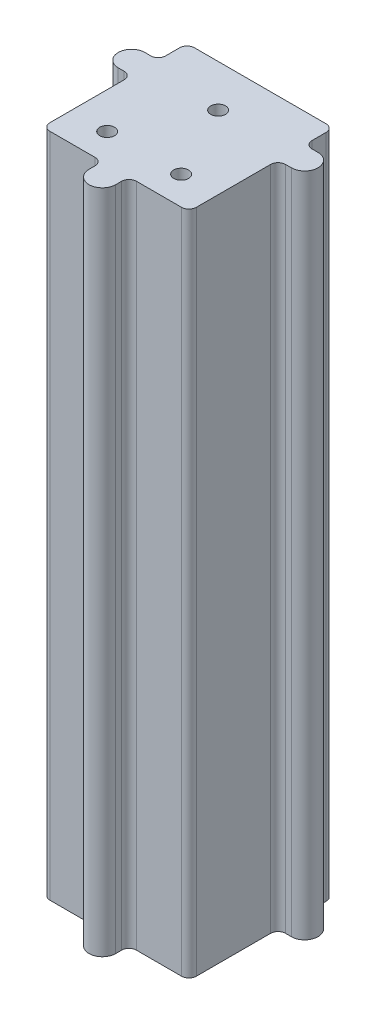
ISO-10303-21;
HEADER;
FILE_DESCRIPTION(('STEP AP214'),'2;1');
FILE_NAME('part.step','',(''),(''),'','','');
FILE_SCHEMA(('AUTOMOTIVE_DESIGN { 1 0 10303 214 1 1 1 1 }'));
ENDSEC;
DATA;
#1=APPLICATION_CONTEXT('core data for automotive mechanical design processes');
#2=APPLICATION_PROTOCOL_DEFINITION('international standard','automotive_design',2000,#1);
#3=PRODUCT_CONTEXT('',#1,'mechanical');
#4=PRODUCT('Part','Part','',(#3));
#5=PRODUCT_RELATED_PRODUCT_CATEGORY('part','',(#4));
#6=PRODUCT_DEFINITION_FORMATION('','',#4);
#7=PRODUCT_DEFINITION_CONTEXT('part definition',#1,'design');
#8=PRODUCT_DEFINITION('design','',#6,#7);
#9=PRODUCT_DEFINITION_SHAPE('','',#8);
#10=(LENGTH_UNIT() NAMED_UNIT(*) SI_UNIT(.MILLI.,.METRE.));
#11=(NAMED_UNIT(*) PLANE_ANGLE_UNIT() SI_UNIT($,.RADIAN.));
#12=(NAMED_UNIT(*) SI_UNIT($,.STERADIAN.) SOLID_ANGLE_UNIT());
#13=UNCERTAINTY_MEASURE_WITH_UNIT(LENGTH_MEASURE(1.E-05),#10,'distance_accuracy_value','');
#14=(GEOMETRIC_REPRESENTATION_CONTEXT(3) GLOBAL_UNCERTAINTY_ASSIGNED_CONTEXT((#13)) GLOBAL_UNIT_ASSIGNED_CONTEXT((#10,
#11,#12)) REPRESENTATION_CONTEXT('',''));
#15=CARTESIAN_POINT('',(0.,0.,0.));
#16=DIRECTION('',(0.,0.,1.));
#17=DIRECTION('',(1.,0.,0.));
#18=AXIS2_PLACEMENT_3D('',#15,#16,#17);
#19=CARTESIAN_POINT('',(-17.8,180.,-22.145));
#20=DIRECTION('',(0.,-1.,0.));
#21=DIRECTION('',(0.,0.,-1.));
#22=AXIS2_PLACEMENT_3D('',#19,#20,#21);
#23=CYLINDRICAL_SURFACE('',#22,2.);
#24=CARTESIAN_POINT('',(-17.8,0.,-22.145));
#25=DIRECTION('',(0.,-1.,0.));
#26=DIRECTION('',(0.,0.,1.));
#27=AXIS2_PLACEMENT_3D('',#24,#25,#26);
#28=CIRCLE('',#27,2.);
#29=CARTESIAN_POINT('',(-19.8,0.,-22.145));
#30=VERTEX_POINT('',#29);
#31=CARTESIAN_POINT('',(-17.8,0.,-24.145));
#32=VERTEX_POINT('',#31);
#33=EDGE_CURVE('E253',#30,#32,#28,.T.);
#34=ORIENTED_EDGE('',*,*,#33,.F.);
#35=DIRECTION('',(0.,-1.,0.));
#36=VECTOR('',#35,1.);
#37=CARTESIAN_POINT('',(-19.8,180.,-22.145));
#38=LINE('',#37,#36);
#39=CARTESIAN_POINT('',(-19.8,180.,-22.145));
#40=VERTEX_POINT('',#39);
#41=EDGE_CURVE('E11',#40,#30,#38,.T.);
#42=ORIENTED_EDGE('',*,*,#41,.F.);
#43=CARTESIAN_POINT('',(-17.8,180.,-22.145));
#44=DIRECTION('',(0.,-1.,0.));
#45=DIRECTION('',(0.,0.,1.));
#46=AXIS2_PLACEMENT_3D('',#43,#44,#45);
#47=CIRCLE('',#46,2.);
#48=CARTESIAN_POINT('',(-17.8,180.,-24.145));
#49=VERTEX_POINT('',#48);
#50=EDGE_CURVE('E354',#40,#49,#47,.T.);
#51=ORIENTED_EDGE('',*,*,#50,.T.);
#52=DIRECTION('',(0.,-1.,0.));
#53=VECTOR('',#52,1.);
#54=CARTESIAN_POINT('',(-17.8,180.,-24.145));
#55=LINE('',#54,#53);
#56=EDGE_CURVE('E46',#49,#32,#55,.T.);
#57=ORIENTED_EDGE('',*,*,#56,.T.);
#58=EDGE_LOOP('',(#34,#42,#51,#57));
#59=FACE_BOUND('',#58,.T.);
#60=ADVANCED_FACE('F43',(#59),#23,.T.);
#61=CARTESIAN_POINT('',(-19.8,180.,-18.345));
#62=DIRECTION('',(-1.,0.,0.));
#63=DIRECTION('',(0.,0.,1.));
#64=AXIS2_PLACEMENT_3D('',#61,#62,#63);
#65=PLANE('',#64);
#66=DIRECTION('',(0.,0.,-1.));
#67=VECTOR('',#66,1.);
#68=CARTESIAN_POINT('',(-19.8,0.,-18.345));
#69=LINE('',#68,#67);
#70=CARTESIAN_POINT('',(-19.8,0.,-18.345));
#71=VERTEX_POINT('',#70);
#72=EDGE_CURVE('E351',#71,#30,#69,.T.);
#73=ORIENTED_EDGE('',*,*,#72,.F.);
#74=DIRECTION('',(0.,-1.,0.));
#75=VECTOR('',#74,1.);
#76=CARTESIAN_POINT('',(-19.8,180.,-18.345));
#77=LINE('',#76,#75);
#78=CARTESIAN_POINT('',(-19.8,180.,-18.345));
#79=VERTEX_POINT('',#78);
#80=EDGE_CURVE('E53',#79,#71,#77,.T.);
#81=ORIENTED_EDGE('',*,*,#80,.F.);
#82=DIRECTION('',(0.,0.,-1.));
#83=VECTOR('',#82,1.);
#84=CARTESIAN_POINT('',(-19.8,180.,-18.345));
#85=LINE('',#84,#83);
#86=EDGE_CURVE('E239',#79,#40,#85,.T.);
#87=ORIENTED_EDGE('',*,*,#86,.T.);
#88=ORIENTED_EDGE('',*,*,#41,.T.);
#89=EDGE_LOOP('',(#73,#81,#87,#88));
#90=FACE_BOUND('',#89,.T.);
#91=ADVANCED_FACE('F426',(#90),#65,.T.);
#92=CARTESIAN_POINT('',(-21.8,180.,-18.345));
#93=DIRECTION('',(0.,-1.,0.));
#94=DIRECTION('',(0.,0.,-1.));
#95=AXIS2_PLACEMENT_3D('',#92,#93,#94);
#96=CYLINDRICAL_SURFACE('',#95,2.);
#97=CARTESIAN_POINT('',(-21.8,0.,-18.345));
#98=DIRECTION('',(0.,1.,0.));
#99=DIRECTION('',(0.,0.,1.));
#100=AXIS2_PLACEMENT_3D('',#97,#98,#99);
#101=CIRCLE('',#100,2.);
#102=CARTESIAN_POINT('',(-21.8,0.,-16.345));
#103=VERTEX_POINT('',#102);
#104=EDGE_CURVE('E225',#103,#71,#101,.T.);
#105=ORIENTED_EDGE('',*,*,#104,.F.);
#106=DIRECTION('',(0.,-1.,0.));
#107=VECTOR('',#106,1.);
#108=CARTESIAN_POINT('',(-21.8,180.,-16.345));
#109=LINE('',#108,#107);
#110=CARTESIAN_POINT('',(-21.8,180.,-16.345));
#111=VERTEX_POINT('',#110);
#112=EDGE_CURVE('E220',#111,#103,#109,.T.);
#113=ORIENTED_EDGE('',*,*,#112,.F.);
#114=CARTESIAN_POINT('',(-21.8,180.,-18.345));
#115=DIRECTION('',(0.,1.,0.));
#116=DIRECTION('',(0.,0.,1.));
#117=AXIS2_PLACEMENT_3D('',#114,#115,#116);
#118=CIRCLE('',#117,2.);
#119=EDGE_CURVE('E223',#111,#79,#118,.T.);
#120=ORIENTED_EDGE('',*,*,#119,.T.);
#121=ORIENTED_EDGE('',*,*,#80,.T.);
#122=EDGE_LOOP('',(#105,#113,#120,#121));
#123=FACE_BOUND('',#122,.T.);
#124=ADVANCED_FACE('F222',(#123),#96,.F.);
#125=CARTESIAN_POINT('',(-23.4,180.,-16.345));
#126=DIRECTION('',(0.,0.,-1.));
#127=DIRECTION('',(-1.,0.,0.));
#128=AXIS2_PLACEMENT_3D('',#125,#126,#127);
#129=PLANE('',#128);
#130=DIRECTION('',(1.,0.,0.));
#131=VECTOR('',#130,1.);
#132=CARTESIAN_POINT('',(-23.4,0.,-16.345));
#133=LINE('',#132,#131);
#134=CARTESIAN_POINT('',(-23.4,0.,-16.345));
#135=VERTEX_POINT('',#134);
#136=EDGE_CURVE('E346',#135,#103,#133,.T.);
#137=ORIENTED_EDGE('',*,*,#136,.F.);
#138=DIRECTION('',(0.,-1.,0.));
#139=VECTOR('',#138,1.);
#140=CARTESIAN_POINT('',(-23.4,180.,-16.345));
#141=LINE('',#140,#139);
#142=CARTESIAN_POINT('',(-23.4,180.,-16.345));
#143=VERTEX_POINT('',#142);
#144=EDGE_CURVE('E231',#143,#135,#141,.T.);
#145=ORIENTED_EDGE('',*,*,#144,.F.);
#146=DIRECTION('',(1.,0.,0.));
#147=VECTOR('',#146,1.);
#148=CARTESIAN_POINT('',(-23.4,180.,-16.345));
#149=LINE('',#148,#147);
#150=EDGE_CURVE('E237',#143,#111,#149,.T.);
#151=ORIENTED_EDGE('',*,*,#150,.T.);
#152=ORIENTED_EDGE('',*,*,#112,.T.);
#153=EDGE_LOOP('',(#137,#145,#151,#152));
#154=FACE_BOUND('',#153,.T.);
#155=ADVANCED_FACE('F242',(#154),#129,.T.);
#156=CARTESIAN_POINT('',(-23.4,180.,-12.745));
#157=DIRECTION('',(0.,-1.,0.));
#158=DIRECTION('',(0.,0.,-1.));
#159=AXIS2_PLACEMENT_3D('',#156,#157,#158);
#160=CYLINDRICAL_SURFACE('',#159,3.6);
#161=CARTESIAN_POINT('',(-23.4,0.,-12.745));
#162=DIRECTION('',(0.,-1.,0.));
#163=DIRECTION('',(0.,0.,-1.));
#164=AXIS2_PLACEMENT_3D('',#161,#162,#163);
#165=CIRCLE('',#164,3.6);
#166=CARTESIAN_POINT('',(-23.4,0.,-9.145));
#167=VERTEX_POINT('',#166);
#168=EDGE_CURVE('E342',#167,#135,#165,.T.);
#169=ORIENTED_EDGE('',*,*,#168,.F.);
#170=DIRECTION('',(0.,-1.,0.));
#171=VECTOR('',#170,1.);
#172=CARTESIAN_POINT('',(-23.4,180.,-9.145));
#173=LINE('',#172,#171);
#174=CARTESIAN_POINT('',(-23.4,180.,-9.145));
#175=VERTEX_POINT('',#174);
#176=EDGE_CURVE('E360',#175,#167,#173,.T.);
#177=ORIENTED_EDGE('',*,*,#176,.F.);
#178=CARTESIAN_POINT('',(-23.4,180.,-12.745));
#179=DIRECTION('',(0.,-1.,0.));
#180=DIRECTION('',(0.,0.,-1.));
#181=AXIS2_PLACEMENT_3D('',#178,#179,#180);
#182=CIRCLE('',#181,3.6);
#183=EDGE_CURVE('E244',#175,#143,#182,.T.);
#184=ORIENTED_EDGE('',*,*,#183,.T.);
#185=ORIENTED_EDGE('',*,*,#144,.T.);
#186=EDGE_LOOP('',(#169,#177,#184,#185));
#187=FACE_BOUND('',#186,.T.);
#188=ADVANCED_FACE('F439',(#187),#160,.T.);
#189=CARTESIAN_POINT('',(-23.4,180.,-9.145));
#190=DIRECTION('',(0.,0.,1.));
#191=DIRECTION('',(1.,0.,0.));
#192=AXIS2_PLACEMENT_3D('',#189,#190,#191);
#193=PLANE('',#192);
#194=DIRECTION('',(-1.,0.,0.));
#195=VECTOR('',#194,1.);
#196=CARTESIAN_POINT('',(-23.4,0.,-9.145));
#197=LINE('',#196,#195);
#198=CARTESIAN_POINT('',(-21.8,0.,-9.145));
#199=VERTEX_POINT('',#198);
#200=EDGE_CURVE('E338',#199,#167,#197,.T.);
#201=ORIENTED_EDGE('',*,*,#200,.F.);
#202=DIRECTION('',(0.,-1.,0.));
#203=VECTOR('',#202,1.);
#204=CARTESIAN_POINT('',(-21.8,180.,-9.145));
#205=LINE('',#204,#203);
#206=CARTESIAN_POINT('',(-21.8,180.,-9.145));
#207=VERTEX_POINT('',#206);
#208=EDGE_CURVE('E363',#207,#199,#205,.T.);
#209=ORIENTED_EDGE('',*,*,#208,.F.);
#210=DIRECTION('',(-1.,0.,0.));
#211=VECTOR('',#210,1.);
#212=CARTESIAN_POINT('',(-23.4,180.,-9.145));
#213=LINE('',#212,#211);
#214=EDGE_CURVE('E247',#207,#175,#213,.T.);
#215=ORIENTED_EDGE('',*,*,#214,.T.);
#216=ORIENTED_EDGE('',*,*,#176,.T.);
#217=EDGE_LOOP('',(#201,#209,#215,#216));
#218=FACE_BOUND('',#217,.T.);
#219=ADVANCED_FACE('F442',(#218),#193,.T.);
#220=CARTESIAN_POINT('',(-21.8,180.,-7.145));
#221=DIRECTION('',(0.,-1.,0.));
#222=DIRECTION('',(0.,0.,-1.));
#223=AXIS2_PLACEMENT_3D('',#220,#221,#222);
#224=CYLINDRICAL_SURFACE('',#223,2.);
#225=CARTESIAN_POINT('',(-21.8,0.,-7.145));
#226=DIRECTION('',(0.,1.,0.));
#227=DIRECTION('',(0.,0.,-1.));
#228=AXIS2_PLACEMENT_3D('',#225,#226,#227);
#229=CIRCLE('',#228,2.);
#230=CARTESIAN_POINT('',(-19.8,0.,-7.14499999999999));
#231=VERTEX_POINT('',#230);
#232=EDGE_CURVE('E334',#231,#199,#229,.T.);
#233=ORIENTED_EDGE('',*,*,#232,.F.);
#234=DIRECTION('',(0.,-1.,0.));
#235=VECTOR('',#234,1.);
#236=CARTESIAN_POINT('',(-19.8,180.,-7.14499999999999));
#237=LINE('',#236,#235);
#238=CARTESIAN_POINT('',(-19.8,180.,-7.14499999999999));
#239=VERTEX_POINT('',#238);
#240=EDGE_CURVE('E366',#239,#231,#237,.T.);
#241=ORIENTED_EDGE('',*,*,#240,.F.);
#242=CARTESIAN_POINT('',(-21.8,180.,-7.145));
#243=DIRECTION('',(0.,1.,0.));
#244=DIRECTION('',(0.,0.,-1.));
#245=AXIS2_PLACEMENT_3D('',#242,#243,#244);
#246=CIRCLE('',#245,2.);
#247=EDGE_CURVE('E710',#239,#207,#246,.T.);
#248=ORIENTED_EDGE('',*,*,#247,.T.);
#249=ORIENTED_EDGE('',*,*,#208,.T.);
#250=EDGE_LOOP('',(#233,#241,#248,#249));
#251=FACE_BOUND('',#250,.T.);
#252=ADVANCED_FACE('F446',(#251),#224,.F.);
#253=CARTESIAN_POINT('',(-19.8,180.,-7.14499999999999));
#254=DIRECTION('',(-1.,0.,0.));
#255=DIRECTION('',(0.,0.,1.));
#256=AXIS2_PLACEMENT_3D('',#253,#254,#255);
#257=PLANE('',#256);
#258=DIRECTION('',(0.,0.,-1.));
#259=VECTOR('',#258,1.);
#260=CARTESIAN_POINT('',(-19.8,0.,-7.14499999999999));
#261=LINE('',#260,#259);
#262=CARTESIAN_POINT('',(-19.8,0.,12.945));
#263=VERTEX_POINT('',#262);
#264=EDGE_CURVE('E330',#263,#231,#261,.T.);
#265=ORIENTED_EDGE('',*,*,#264,.F.);
#266=DIRECTION('',(0.,-1.,0.));
#267=VECTOR('',#266,1.);
#268=CARTESIAN_POINT('',(-19.8,180.,12.945));
#269=LINE('',#268,#267);
#270=CARTESIAN_POINT('',(-19.8,180.,12.945));
#271=VERTEX_POINT('',#270);
#272=EDGE_CURVE('E369',#271,#263,#269,.T.);
#273=ORIENTED_EDGE('',*,*,#272,.F.);
#274=DIRECTION('',(0.,0.,-1.));
#275=VECTOR('',#274,1.);
#276=CARTESIAN_POINT('',(-19.8,180.,-7.14499999999999));
#277=LINE('',#276,#275);
#278=EDGE_CURVE('E706',#271,#239,#277,.T.);
#279=ORIENTED_EDGE('',*,*,#278,.T.);
#280=ORIENTED_EDGE('',*,*,#240,.T.);
#281=EDGE_LOOP('',(#265,#273,#279,#280));
#282=FACE_BOUND('',#281,.T.);
#283=ADVANCED_FACE('F450',(#282),#257,.T.);
#284=CARTESIAN_POINT('',(-17.8,180.,12.945));
#285=DIRECTION('',(0.,-1.,0.));
#286=DIRECTION('',(0.,0.,-1.));
#287=AXIS2_PLACEMENT_3D('',#284,#285,#286);
#288=CYLINDRICAL_SURFACE('',#287,2.);
#289=CARTESIAN_POINT('',(-17.8,0.,12.945));
#290=DIRECTION('',(0.,-1.,0.));
#291=DIRECTION('',(0.,0.,1.));
#292=AXIS2_PLACEMENT_3D('',#289,#290,#291);
#293=CIRCLE('',#292,2.);
#294=CARTESIAN_POINT('',(-17.8,0.,14.945));
#295=VERTEX_POINT('',#294);
#296=EDGE_CURVE('E326',#295,#263,#293,.T.);
#297=ORIENTED_EDGE('',*,*,#296,.F.);
#298=DIRECTION('',(0.,-1.,0.));
#299=VECTOR('',#298,1.);
#300=CARTESIAN_POINT('',(-17.8,180.,14.945));
#301=LINE('',#300,#299);
#302=CARTESIAN_POINT('',(-17.8,180.,14.945));
#303=VERTEX_POINT('',#302);
#304=EDGE_CURVE('E372',#303,#295,#301,.T.);
#305=ORIENTED_EDGE('',*,*,#304,.F.);
#306=CARTESIAN_POINT('',(-17.8,180.,12.945));
#307=DIRECTION('',(0.,-1.,0.));
#308=DIRECTION('',(0.,0.,1.));
#309=AXIS2_PLACEMENT_3D('',#306,#307,#308);
#310=CIRCLE('',#309,2.);
#311=EDGE_CURVE('E702',#303,#271,#310,.T.);
#312=ORIENTED_EDGE('',*,*,#311,.T.);
#313=ORIENTED_EDGE('',*,*,#272,.T.);
#314=EDGE_LOOP('',(#297,#305,#312,#313));
#315=FACE_BOUND('',#314,.T.);
#316=ADVANCED_FACE('F454',(#315),#288,.T.);
#317=CARTESIAN_POINT('',(-17.8,180.,14.945));
#318=DIRECTION('',(0.,0.,1.));
#319=DIRECTION('',(1.,0.,0.));
#320=AXIS2_PLACEMENT_3D('',#317,#318,#319);
#321=PLANE('',#320);
#322=DIRECTION('',(-1.,0.,0.));
#323=VECTOR('',#322,1.);
#324=CARTESIAN_POINT('',(-17.8,0.,14.945));
#325=LINE('',#324,#323);
#326=CARTESIAN_POINT('',(-5.60000000000002,0.,14.945));
#327=VERTEX_POINT('',#326);
#328=EDGE_CURVE('E322',#327,#295,#325,.T.);
#329=ORIENTED_EDGE('',*,*,#328,.F.);
#330=DIRECTION('',(0.,-1.,0.));
#331=VECTOR('',#330,1.);
#332=CARTESIAN_POINT('',(-5.60000000000002,180.,14.945));
#333=LINE('',#332,#331);
#334=CARTESIAN_POINT('',(-5.60000000000002,180.,14.945));
#335=VERTEX_POINT('',#334);
#336=EDGE_CURVE('E375',#335,#327,#333,.T.);
#337=ORIENTED_EDGE('',*,*,#336,.F.);
#338=DIRECTION('',(-1.,0.,0.));
#339=VECTOR('',#338,1.);
#340=CARTESIAN_POINT('',(-17.8,180.,14.945));
#341=LINE('',#340,#339);
#342=EDGE_CURVE('E698',#335,#303,#341,.T.);
#343=ORIENTED_EDGE('',*,*,#342,.T.);
#344=ORIENTED_EDGE('',*,*,#304,.T.);
#345=EDGE_LOOP('',(#329,#337,#343,#344));
#346=FACE_BOUND('',#345,.T.);
#347=ADVANCED_FACE('F458',(#346),#321,.T.);
#348=CARTESIAN_POINT('',(-5.60000000000001,180.,16.945));
#349=DIRECTION('',(0.,-1.,0.));
#350=DIRECTION('',(0.,0.,-1.));
#351=AXIS2_PLACEMENT_3D('',#348,#349,#350);
#352=CYLINDRICAL_SURFACE('',#351,2.);
#353=CARTESIAN_POINT('',(-5.60000000000001,0.,16.945));
#354=DIRECTION('',(0.,1.,0.));
#355=DIRECTION('',(0.,0.,-1.));
#356=AXIS2_PLACEMENT_3D('',#353,#354,#355);
#357=CIRCLE('',#356,2.);
#358=CARTESIAN_POINT('',(-3.60000000000001,0.,16.945));
#359=VERTEX_POINT('',#358);
#360=EDGE_CURVE('E318',#359,#327,#357,.T.);
#361=ORIENTED_EDGE('',*,*,#360,.F.);
#362=DIRECTION('',(0.,-1.,0.));
#363=VECTOR('',#362,1.);
#364=CARTESIAN_POINT('',(-3.60000000000001,180.,16.945));
#365=LINE('',#364,#363);
#366=CARTESIAN_POINT('',(-3.60000000000001,180.,16.945));
#367=VERTEX_POINT('',#366);
#368=EDGE_CURVE('E378',#367,#359,#365,.T.);
#369=ORIENTED_EDGE('',*,*,#368,.F.);
#370=CARTESIAN_POINT('',(-5.60000000000001,180.,16.945));
#371=DIRECTION('',(0.,1.,0.));
#372=DIRECTION('',(0.,0.,-1.));
#373=AXIS2_PLACEMENT_3D('',#370,#371,#372);
#374=CIRCLE('',#373,2.);
#375=EDGE_CURVE('E694',#367,#335,#374,.T.);
#376=ORIENTED_EDGE('',*,*,#375,.T.);
#377=ORIENTED_EDGE('',*,*,#336,.T.);
#378=EDGE_LOOP('',(#361,#369,#376,#377));
#379=FACE_BOUND('',#378,.T.);
#380=ADVANCED_FACE('F462',(#379),#352,.F.);
#381=CARTESIAN_POINT('',(-3.60000000000001,180.,16.945));
#382=DIRECTION('',(-1.,0.,0.));
#383=DIRECTION('',(0.,0.,1.));
#384=AXIS2_PLACEMENT_3D('',#381,#382,#383);
#385=PLANE('',#384);
#386=DIRECTION('',(0.,0.,-1.));
#387=VECTOR('',#386,1.);
#388=CARTESIAN_POINT('',(-3.60000000000001,0.,16.945));
#389=LINE('',#388,#387);
#390=CARTESIAN_POINT('',(-3.60000000000001,0.,18.545));
#391=VERTEX_POINT('',#390);
#392=EDGE_CURVE('E314',#391,#359,#389,.T.);
#393=ORIENTED_EDGE('',*,*,#392,.F.);
#394=DIRECTION('',(0.,-1.,0.));
#395=VECTOR('',#394,1.);
#396=CARTESIAN_POINT('',(-3.60000000000001,180.,18.545));
#397=LINE('',#396,#395);
#398=CARTESIAN_POINT('',(-3.60000000000001,180.,18.545));
#399=VERTEX_POINT('',#398);
#400=EDGE_CURVE('E381',#399,#391,#397,.T.);
#401=ORIENTED_EDGE('',*,*,#400,.F.);
#402=DIRECTION('',(0.,0.,-1.));
#403=VECTOR('',#402,1.);
#404=CARTESIAN_POINT('',(-3.60000000000001,180.,16.945));
#405=LINE('',#404,#403);
#406=EDGE_CURVE('E690',#399,#367,#405,.T.);
#407=ORIENTED_EDGE('',*,*,#406,.T.);
#408=ORIENTED_EDGE('',*,*,#368,.T.);
#409=EDGE_LOOP('',(#393,#401,#407,#408));
#410=FACE_BOUND('',#409,.T.);
#411=ADVANCED_FACE('F466',(#410),#385,.T.);
#412=CARTESIAN_POINT('',(0.,180.,18.545));
#413=DIRECTION('',(0.,-1.,0.));
#414=DIRECTION('',(0.,0.,-1.));
#415=AXIS2_PLACEMENT_3D('',#412,#413,#414);
#416=CYLINDRICAL_SURFACE('',#415,3.6);
#417=CARTESIAN_POINT('',(0.,0.,18.545));
#418=DIRECTION('',(0.,-1.,0.));
#419=DIRECTION('',(0.,0.,-1.));
#420=AXIS2_PLACEMENT_3D('',#417,#418,#419);
#421=CIRCLE('',#420,3.6);
#422=CARTESIAN_POINT('',(3.59999999999999,0.,18.545));
#423=VERTEX_POINT('',#422);
#424=EDGE_CURVE('E310',#423,#391,#421,.T.);
#425=ORIENTED_EDGE('',*,*,#424,.F.);
#426=DIRECTION('',(0.,-1.,0.));
#427=VECTOR('',#426,1.);
#428=CARTESIAN_POINT('',(3.59999999999999,180.,18.545));
#429=LINE('',#428,#427);
#430=CARTESIAN_POINT('',(3.59999999999999,180.,18.545));
#431=VERTEX_POINT('',#430);
#432=EDGE_CURVE('E384',#431,#423,#429,.T.);
#433=ORIENTED_EDGE('',*,*,#432,.F.);
#434=CARTESIAN_POINT('',(0.,180.,18.545));
#435=DIRECTION('',(0.,-1.,0.));
#436=DIRECTION('',(0.,0.,-1.));
#437=AXIS2_PLACEMENT_3D('',#434,#435,#436);
#438=CIRCLE('',#437,3.6);
#439=EDGE_CURVE('E686',#431,#399,#438,.T.);
#440=ORIENTED_EDGE('',*,*,#439,.T.);
#441=ORIENTED_EDGE('',*,*,#400,.T.);
#442=EDGE_LOOP('',(#425,#433,#440,#441));
#443=FACE_BOUND('',#442,.T.);
#444=ADVANCED_FACE('F470',(#443),#416,.T.);
#445=CARTESIAN_POINT('',(3.59999999999999,180.,18.545));
#446=DIRECTION('',(1.,0.,0.));
#447=DIRECTION('',(0.,0.,-1.));
#448=AXIS2_PLACEMENT_3D('',#445,#446,#447);
#449=PLANE('',#448);
#450=DIRECTION('',(0.,0.,1.));
#451=VECTOR('',#450,1.);
#452=CARTESIAN_POINT('',(3.59999999999999,0.,18.545));
#453=LINE('',#452,#451);
#454=CARTESIAN_POINT('',(3.59999999999999,0.,16.945));
#455=VERTEX_POINT('',#454);
#456=EDGE_CURVE('E306',#455,#423,#453,.T.);
#457=ORIENTED_EDGE('',*,*,#456,.F.);
#458=DIRECTION('',(0.,-1.,0.));
#459=VECTOR('',#458,1.);
#460=CARTESIAN_POINT('',(3.59999999999999,180.,16.945));
#461=LINE('',#460,#459);
#462=CARTESIAN_POINT('',(3.59999999999999,180.,16.945));
#463=VERTEX_POINT('',#462);
#464=EDGE_CURVE('E387',#463,#455,#461,.T.);
#465=ORIENTED_EDGE('',*,*,#464,.F.);
#466=DIRECTION('',(0.,0.,1.));
#467=VECTOR('',#466,1.);
#468=CARTESIAN_POINT('',(3.59999999999999,180.,18.545));
#469=LINE('',#468,#467);
#470=EDGE_CURVE('E682',#463,#431,#469,.T.);
#471=ORIENTED_EDGE('',*,*,#470,.T.);
#472=ORIENTED_EDGE('',*,*,#432,.T.);
#473=EDGE_LOOP('',(#457,#465,#471,#472));
#474=FACE_BOUND('',#473,.T.);
#475=ADVANCED_FACE('F474',(#474),#449,.T.);
#476=CARTESIAN_POINT('',(5.59999999999999,180.,16.945));
#477=DIRECTION('',(0.,-1.,0.));
#478=DIRECTION('',(0.,0.,-1.));
#479=AXIS2_PLACEMENT_3D('',#476,#477,#478);
#480=CYLINDRICAL_SURFACE('',#479,2.);
#481=CARTESIAN_POINT('',(5.59999999999999,0.,16.945));
#482=DIRECTION('',(0.,1.,0.));
#483=DIRECTION('',(0.,0.,1.));
#484=AXIS2_PLACEMENT_3D('',#481,#482,#483);
#485=CIRCLE('',#484,2.);
#486=CARTESIAN_POINT('',(5.6,0.,14.945));
#487=VERTEX_POINT('',#486);
#488=EDGE_CURVE('E302',#487,#455,#485,.T.);
#489=ORIENTED_EDGE('',*,*,#488,.F.);
#490=DIRECTION('',(0.,-1.,0.));
#491=VECTOR('',#490,1.);
#492=CARTESIAN_POINT('',(5.6,180.,14.945));
#493=LINE('',#492,#491);
#494=CARTESIAN_POINT('',(5.6,180.,14.945));
#495=VERTEX_POINT('',#494);
#496=EDGE_CURVE('E390',#495,#487,#493,.T.);
#497=ORIENTED_EDGE('',*,*,#496,.F.);
#498=CARTESIAN_POINT('',(5.59999999999999,180.,16.945));
#499=DIRECTION('',(0.,1.,0.));
#500=DIRECTION('',(0.,0.,1.));
#501=AXIS2_PLACEMENT_3D('',#498,#499,#500);
#502=CIRCLE('',#501,2.);
#503=EDGE_CURVE('E678',#495,#463,#502,.T.);
#504=ORIENTED_EDGE('',*,*,#503,.T.);
#505=ORIENTED_EDGE('',*,*,#464,.T.);
#506=EDGE_LOOP('',(#489,#497,#504,#505));
#507=FACE_BOUND('',#506,.T.);
#508=ADVANCED_FACE('F478',(#507),#480,.F.);
#509=CARTESIAN_POINT('',(5.6,180.,14.945));
#510=DIRECTION('',(0.,0.,1.));
#511=DIRECTION('',(1.,0.,0.));
#512=AXIS2_PLACEMENT_3D('',#509,#510,#511);
#513=PLANE('',#512);
#514=DIRECTION('',(-1.,0.,0.));
#515=VECTOR('',#514,1.);
#516=CARTESIAN_POINT('',(5.6,0.,14.945));
#517=LINE('',#516,#515);
#518=CARTESIAN_POINT('',(17.8,0.,14.945));
#519=VERTEX_POINT('',#518);
#520=EDGE_CURVE('E298',#519,#487,#517,.T.);
#521=ORIENTED_EDGE('',*,*,#520,.F.);
#522=DIRECTION('',(0.,-1.,0.));
#523=VECTOR('',#522,1.);
#524=CARTESIAN_POINT('',(17.8,180.,14.945));
#525=LINE('',#524,#523);
#526=CARTESIAN_POINT('',(17.8,180.,14.945));
#527=VERTEX_POINT('',#526);
#528=EDGE_CURVE('E393',#527,#519,#525,.T.);
#529=ORIENTED_EDGE('',*,*,#528,.F.);
#530=DIRECTION('',(-1.,0.,0.));
#531=VECTOR('',#530,1.);
#532=CARTESIAN_POINT('',(5.6,180.,14.945));
#533=LINE('',#532,#531);
#534=EDGE_CURVE('E674',#527,#495,#533,.T.);
#535=ORIENTED_EDGE('',*,*,#534,.T.);
#536=ORIENTED_EDGE('',*,*,#496,.T.);
#537=EDGE_LOOP('',(#521,#529,#535,#536));
#538=FACE_BOUND('',#537,.T.);
#539=ADVANCED_FACE('F482',(#538),#513,.T.);
#540=CARTESIAN_POINT('',(17.8,180.,12.945));
#541=DIRECTION('',(0.,-1.,0.));
#542=DIRECTION('',(0.,0.,-1.));
#543=AXIS2_PLACEMENT_3D('',#540,#541,#542);
#544=CYLINDRICAL_SURFACE('',#543,2.);
#545=CARTESIAN_POINT('',(17.8,0.,12.945));
#546=DIRECTION('',(0.,-1.,0.));
#547=DIRECTION('',(0.,0.,-1.));
#548=AXIS2_PLACEMENT_3D('',#545,#546,#547);
#549=CIRCLE('',#548,2.);
#550=CARTESIAN_POINT('',(19.8,0.,12.945));
#551=VERTEX_POINT('',#550);
#552=EDGE_CURVE('E294',#551,#519,#549,.T.);
#553=ORIENTED_EDGE('',*,*,#552,.F.);
#554=DIRECTION('',(0.,-1.,0.));
#555=VECTOR('',#554,1.);
#556=CARTESIAN_POINT('',(19.8,180.,12.945));
#557=LINE('',#556,#555);
#558=CARTESIAN_POINT('',(19.8,180.,12.945));
#559=VERTEX_POINT('',#558);
#560=EDGE_CURVE('E396',#559,#551,#557,.T.);
#561=ORIENTED_EDGE('',*,*,#560,.F.);
#562=CARTESIAN_POINT('',(17.8,180.,12.945));
#563=DIRECTION('',(0.,-1.,0.));
#564=DIRECTION('',(0.,0.,-1.));
#565=AXIS2_PLACEMENT_3D('',#562,#563,#564);
#566=CIRCLE('',#565,2.);
#567=EDGE_CURVE('E670',#559,#527,#566,.T.);
#568=ORIENTED_EDGE('',*,*,#567,.T.);
#569=ORIENTED_EDGE('',*,*,#528,.T.);
#570=EDGE_LOOP('',(#553,#561,#568,#569));
#571=FACE_BOUND('',#570,.T.);
#572=ADVANCED_FACE('F486',(#571),#544,.T.);
#573=CARTESIAN_POINT('',(19.8,180.,12.945));
#574=DIRECTION('',(1.,0.,0.));
#575=DIRECTION('',(0.,0.,-1.));
#576=AXIS2_PLACEMENT_3D('',#573,#574,#575);
#577=PLANE('',#576);
#578=DIRECTION('',(0.,0.,1.));
#579=VECTOR('',#578,1.);
#580=CARTESIAN_POINT('',(19.8,0.,12.945));
#581=LINE('',#580,#579);
#582=CARTESIAN_POINT('',(19.8,0.,-7.14499999999998));
#583=VERTEX_POINT('',#582);
#584=EDGE_CURVE('E290',#583,#551,#581,.T.);
#585=ORIENTED_EDGE('',*,*,#584,.F.);
#586=DIRECTION('',(0.,-1.,0.));
#587=VECTOR('',#586,1.);
#588=CARTESIAN_POINT('',(19.8,180.,-7.14499999999998));
#589=LINE('',#588,#587);
#590=CARTESIAN_POINT('',(19.8,180.,-7.14499999999998));
#591=VERTEX_POINT('',#590);
#592=EDGE_CURVE('E399',#591,#583,#589,.T.);
#593=ORIENTED_EDGE('',*,*,#592,.F.);
#594=DIRECTION('',(0.,0.,1.));
#595=VECTOR('',#594,1.);
#596=CARTESIAN_POINT('',(19.8,180.,12.945));
#597=LINE('',#596,#595);
#598=EDGE_CURVE('E666',#591,#559,#597,.T.);
#599=ORIENTED_EDGE('',*,*,#598,.T.);
#600=ORIENTED_EDGE('',*,*,#560,.T.);
#601=EDGE_LOOP('',(#585,#593,#599,#600));
#602=FACE_BOUND('',#601,.T.);
#603=ADVANCED_FACE('F490',(#602),#577,.T.);
#604=CARTESIAN_POINT('',(21.8,180.,-7.14499999999999));
#605=DIRECTION('',(0.,-1.,0.));
#606=DIRECTION('',(0.,0.,-1.));
#607=AXIS2_PLACEMENT_3D('',#604,#605,#606);
#608=CYLINDRICAL_SURFACE('',#607,2.);
#609=CARTESIAN_POINT('',(21.8,0.,-7.14499999999999));
#610=DIRECTION('',(0.,1.,0.));
#611=DIRECTION('',(0.,0.,1.));
#612=AXIS2_PLACEMENT_3D('',#609,#610,#611);
#613=CIRCLE('',#612,2.);
#614=CARTESIAN_POINT('',(21.8,0.,-9.14499999999999));
#615=VERTEX_POINT('',#614);
#616=EDGE_CURVE('E286',#615,#583,#613,.T.);
#617=ORIENTED_EDGE('',*,*,#616,.F.);
#618=DIRECTION('',(0.,-1.,0.));
#619=VECTOR('',#618,1.);
#620=CARTESIAN_POINT('',(21.8,180.,-9.14499999999999));
#621=LINE('',#620,#619);
#622=CARTESIAN_POINT('',(21.8,180.,-9.14499999999999));
#623=VERTEX_POINT('',#622);
#624=EDGE_CURVE('E402',#623,#615,#621,.T.);
#625=ORIENTED_EDGE('',*,*,#624,.F.);
#626=CARTESIAN_POINT('',(21.8,180.,-7.14499999999999));
#627=DIRECTION('',(0.,1.,0.));
#628=DIRECTION('',(0.,0.,1.));
#629=AXIS2_PLACEMENT_3D('',#626,#627,#628);
#630=CIRCLE('',#629,2.);
#631=EDGE_CURVE('E662',#623,#591,#630,.T.);
#632=ORIENTED_EDGE('',*,*,#631,.T.);
#633=ORIENTED_EDGE('',*,*,#592,.T.);
#634=EDGE_LOOP('',(#617,#625,#632,#633));
#635=FACE_BOUND('',#634,.T.);
#636=ADVANCED_FACE('F494',(#635),#608,.F.);
#637=CARTESIAN_POINT('',(21.8,180.,-9.14499999999999));
#638=DIRECTION('',(0.,0.,1.));
#639=DIRECTION('',(1.,0.,0.));
#640=AXIS2_PLACEMENT_3D('',#637,#638,#639);
#641=PLANE('',#640);
#642=DIRECTION('',(-1.,0.,0.));
#643=VECTOR('',#642,1.);
#644=CARTESIAN_POINT('',(21.8,0.,-9.14499999999999));
#645=LINE('',#644,#643);
#646=CARTESIAN_POINT('',(23.4,0.,-9.14499999999999));
#647=VERTEX_POINT('',#646);
#648=EDGE_CURVE('E282',#647,#615,#645,.T.);
#649=ORIENTED_EDGE('',*,*,#648,.F.);
#650=DIRECTION('',(0.,-1.,0.));
#651=VECTOR('',#650,1.);
#652=CARTESIAN_POINT('',(23.4,180.,-9.14499999999999));
#653=LINE('',#652,#651);
#654=CARTESIAN_POINT('',(23.4,180.,-9.14499999999999));
#655=VERTEX_POINT('',#654);
#656=EDGE_CURVE('E405',#655,#647,#653,.T.);
#657=ORIENTED_EDGE('',*,*,#656,.F.);
#658=DIRECTION('',(-1.,0.,0.));
#659=VECTOR('',#658,1.);
#660=CARTESIAN_POINT('',(21.8,180.,-9.14499999999999));
#661=LINE('',#660,#659);
#662=EDGE_CURVE('E658',#655,#623,#661,.T.);
#663=ORIENTED_EDGE('',*,*,#662,.T.);
#664=ORIENTED_EDGE('',*,*,#624,.T.);
#665=EDGE_LOOP('',(#649,#657,#663,#664));
#666=FACE_BOUND('',#665,.T.);
#667=ADVANCED_FACE('F498',(#666),#641,.T.);
#668=CARTESIAN_POINT('',(23.4,180.,-12.745));
#669=DIRECTION('',(0.,-1.,0.));
#670=DIRECTION('',(0.,0.,-1.));
#671=AXIS2_PLACEMENT_3D('',#668,#669,#670);
#672=CYLINDRICAL_SURFACE('',#671,3.6);
#673=CARTESIAN_POINT('',(23.4,0.,-12.745));
#674=DIRECTION('',(0.,-1.,0.));
#675=DIRECTION('',(0.,0.,1.));
#676=AXIS2_PLACEMENT_3D('',#673,#674,#675);
#677=CIRCLE('',#676,3.6);
#678=CARTESIAN_POINT('',(23.4,0.,-16.345));
#679=VERTEX_POINT('',#678);
#680=EDGE_CURVE('E278',#679,#647,#677,.T.);
#681=ORIENTED_EDGE('',*,*,#680,.F.);
#682=DIRECTION('',(0.,-1.,0.));
#683=VECTOR('',#682,1.);
#684=CARTESIAN_POINT('',(23.4,180.,-16.345));
#685=LINE('',#684,#683);
#686=CARTESIAN_POINT('',(23.4,180.,-16.345));
#687=VERTEX_POINT('',#686);
#688=EDGE_CURVE('E408',#687,#679,#685,.T.);
#689=ORIENTED_EDGE('',*,*,#688,.F.);
#690=CARTESIAN_POINT('',(23.4,180.,-12.745));
#691=DIRECTION('',(0.,-1.,0.));
#692=DIRECTION('',(0.,0.,1.));
#693=AXIS2_PLACEMENT_3D('',#690,#691,#692);
#694=CIRCLE('',#693,3.6);
#695=EDGE_CURVE('E654',#687,#655,#694,.T.);
#696=ORIENTED_EDGE('',*,*,#695,.T.);
#697=ORIENTED_EDGE('',*,*,#656,.T.);
#698=EDGE_LOOP('',(#681,#689,#696,#697));
#699=FACE_BOUND('',#698,.T.);
#700=ADVANCED_FACE('F502',(#699),#672,.T.);
#701=CARTESIAN_POINT('',(23.4,180.,-16.345));
#702=DIRECTION('',(0.,0.,-1.));
#703=DIRECTION('',(-1.,0.,0.));
#704=AXIS2_PLACEMENT_3D('',#701,#702,#703);
#705=PLANE('',#704);
#706=DIRECTION('',(1.,0.,0.));
#707=VECTOR('',#706,1.);
#708=CARTESIAN_POINT('',(23.4,0.,-16.345));
#709=LINE('',#708,#707);
#710=CARTESIAN_POINT('',(21.8,0.,-16.345));
#711=VERTEX_POINT('',#710);
#712=EDGE_CURVE('E274',#711,#679,#709,.T.);
#713=ORIENTED_EDGE('',*,*,#712,.F.);
#714=DIRECTION('',(0.,-1.,0.));
#715=VECTOR('',#714,1.);
#716=CARTESIAN_POINT('',(21.8,180.,-16.345));
#717=LINE('',#716,#715);
#718=CARTESIAN_POINT('',(21.8,180.,-16.345));
#719=VERTEX_POINT('',#718);
#720=EDGE_CURVE('E411',#719,#711,#717,.T.);
#721=ORIENTED_EDGE('',*,*,#720,.F.);
#722=DIRECTION('',(1.,0.,0.));
#723=VECTOR('',#722,1.);
#724=CARTESIAN_POINT('',(23.4,180.,-16.345));
#725=LINE('',#724,#723);
#726=EDGE_CURVE('E650',#719,#687,#725,.T.);
#727=ORIENTED_EDGE('',*,*,#726,.T.);
#728=ORIENTED_EDGE('',*,*,#688,.T.);
#729=EDGE_LOOP('',(#713,#721,#727,#728));
#730=FACE_BOUND('',#729,.T.);
#731=ADVANCED_FACE('F506',(#730),#705,.T.);
#732=CARTESIAN_POINT('',(21.8,180.,-18.345));
#733=DIRECTION('',(0.,-1.,0.));
#734=DIRECTION('',(0.,0.,-1.));
#735=AXIS2_PLACEMENT_3D('',#732,#733,#734);
#736=CYLINDRICAL_SURFACE('',#735,2.);
#737=CARTESIAN_POINT('',(21.8,0.,-18.345));
#738=DIRECTION('',(0.,1.,0.));
#739=DIRECTION('',(0.,0.,1.));
#740=AXIS2_PLACEMENT_3D('',#737,#738,#739);
#741=CIRCLE('',#740,2.);
#742=CARTESIAN_POINT('',(19.8,0.,-18.345));
#743=VERTEX_POINT('',#742);
#744=EDGE_CURVE('E270',#743,#711,#741,.T.);
#745=ORIENTED_EDGE('',*,*,#744,.F.);
#746=DIRECTION('',(0.,-1.,0.));
#747=VECTOR('',#746,1.);
#748=CARTESIAN_POINT('',(19.8,180.,-18.345));
#749=LINE('',#748,#747);
#750=CARTESIAN_POINT('',(19.8,180.,-18.345));
#751=VERTEX_POINT('',#750);
#752=EDGE_CURVE('E414',#751,#743,#749,.T.);
#753=ORIENTED_EDGE('',*,*,#752,.F.);
#754=CARTESIAN_POINT('',(21.8,180.,-18.345));
#755=DIRECTION('',(0.,1.,0.));
#756=DIRECTION('',(0.,0.,1.));
#757=AXIS2_PLACEMENT_3D('',#754,#755,#756);
#758=CIRCLE('',#757,2.);
#759=EDGE_CURVE('E646',#751,#719,#758,.T.);
#760=ORIENTED_EDGE('',*,*,#759,.T.);
#761=ORIENTED_EDGE('',*,*,#720,.T.);
#762=EDGE_LOOP('',(#745,#753,#760,#761));
#763=FACE_BOUND('',#762,.T.);
#764=ADVANCED_FACE('F510',(#763),#736,.F.);
#765=CARTESIAN_POINT('',(19.8,180.,-18.345));
#766=DIRECTION('',(1.,0.,0.));
#767=DIRECTION('',(0.,0.,-1.));
#768=AXIS2_PLACEMENT_3D('',#765,#766,#767);
#769=PLANE('',#768);
#770=DIRECTION('',(0.,0.,1.));
#771=VECTOR('',#770,1.);
#772=CARTESIAN_POINT('',(19.8,0.,-18.345));
#773=LINE('',#772,#771);
#774=CARTESIAN_POINT('',(19.8,0.,-22.145));
#775=VERTEX_POINT('',#774);
#776=EDGE_CURVE('E266',#775,#743,#773,.T.);
#777=ORIENTED_EDGE('',*,*,#776,.F.);
#778=DIRECTION('',(0.,-1.,0.));
#779=VECTOR('',#778,1.);
#780=CARTESIAN_POINT('',(19.8,180.,-22.145));
#781=LINE('',#780,#779);
#782=CARTESIAN_POINT('',(19.8,180.,-22.145));
#783=VERTEX_POINT('',#782);
#784=EDGE_CURVE('E417',#783,#775,#781,.T.);
#785=ORIENTED_EDGE('',*,*,#784,.F.);
#786=DIRECTION('',(0.,0.,1.));
#787=VECTOR('',#786,1.);
#788=CARTESIAN_POINT('',(19.8,180.,-18.345));
#789=LINE('',#788,#787);
#790=EDGE_CURVE('E642',#783,#751,#789,.T.);
#791=ORIENTED_EDGE('',*,*,#790,.T.);
#792=ORIENTED_EDGE('',*,*,#752,.T.);
#793=EDGE_LOOP('',(#777,#785,#791,#792));
#794=FACE_BOUND('',#793,.T.);
#795=ADVANCED_FACE('F514',(#794),#769,.T.);
#796=CARTESIAN_POINT('',(17.8,180.,-22.145));
#797=DIRECTION('',(0.,-1.,0.));
#798=DIRECTION('',(0.,0.,-1.));
#799=AXIS2_PLACEMENT_3D('',#796,#797,#798);
#800=CYLINDRICAL_SURFACE('',#799,2.);
#801=CARTESIAN_POINT('',(17.8,0.,-22.145));
#802=DIRECTION('',(0.,-1.,0.));
#803=DIRECTION('',(0.,0.,-1.));
#804=AXIS2_PLACEMENT_3D('',#801,#802,#803);
#805=CIRCLE('',#804,2.);
#806=CARTESIAN_POINT('',(17.8,0.,-24.145));
#807=VERTEX_POINT('',#806);
#808=EDGE_CURVE('E262',#807,#775,#805,.T.);
#809=ORIENTED_EDGE('',*,*,#808,.F.);
#810=DIRECTION('',(0.,-1.,0.));
#811=VECTOR('',#810,1.);
#812=CARTESIAN_POINT('',(17.8,180.,-24.145));
#813=LINE('',#812,#811);
#814=CARTESIAN_POINT('',(17.8,180.,-24.145));
#815=VERTEX_POINT('',#814);
#816=EDGE_CURVE('E419',#815,#807,#813,.T.);
#817=ORIENTED_EDGE('',*,*,#816,.F.);
#818=CARTESIAN_POINT('',(17.8,180.,-22.145));
#819=DIRECTION('',(0.,-1.,0.));
#820=DIRECTION('',(0.,0.,-1.));
#821=AXIS2_PLACEMENT_3D('',#818,#819,#820);
#822=CIRCLE('',#821,2.);
#823=EDGE_CURVE('E638',#815,#783,#822,.T.);
#824=ORIENTED_EDGE('',*,*,#823,.T.);
#825=ORIENTED_EDGE('',*,*,#784,.T.);
#826=EDGE_LOOP('',(#809,#817,#824,#825));
#827=FACE_BOUND('',#826,.T.);
#828=ADVANCED_FACE('F518',(#827),#800,.T.);
#829=CARTESIAN_POINT('',(3.59999999999999,180.,-24.145));
#830=DIRECTION('',(0.,0.,-1.));
#831=DIRECTION('',(-1.,0.,0.));
#832=AXIS2_PLACEMENT_3D('',#829,#830,#831);
#833=PLANE('',#832);
#834=DIRECTION('',(1.,0.,0.));
#835=VECTOR('',#834,1.);
#836=CARTESIAN_POINT('',(3.59999999999999,0.,-24.145));
#837=LINE('',#836,#835);
#838=EDGE_CURVE('E257',#32,#807,#837,.T.);
#839=ORIENTED_EDGE('',*,*,#838,.F.);
#840=ORIENTED_EDGE('',*,*,#56,.F.);
#841=DIRECTION('',(1.,0.,0.));
#842=VECTOR('',#841,1.);
#843=CARTESIAN_POINT('',(-17.8,180.,-24.145));
#844=LINE('',#843,#842);
#845=EDGE_CURVE('E635',#49,#815,#844,.T.);
#846=ORIENTED_EDGE('',*,*,#845,.T.);
#847=ORIENTED_EDGE('',*,*,#816,.T.);
#848=EDGE_LOOP('',(#839,#840,#846,#847));
#849=FACE_BOUND('',#848,.T.);
#850=ADVANCED_FACE('F521',(#849),#833,.T.);
#851=CARTESIAN_POINT('',(-17.8,180.,-22.145));
#852=DIRECTION('',(0.,1.,0.));
#853=DIRECTION('',(0.,0.,1.));
#854=AXIS2_PLACEMENT_3D('',#851,#852,#853);
#855=PLANE('',#854);
#856=CARTESIAN_POINT('',(0.,180.,-12.745));
#857=DIRECTION('',(0.,1.,0.));
#858=DIRECTION('',(0.,0.,1.));
#859=AXIS2_PLACEMENT_3D('',#856,#857,#858);
#860=CIRCLE('',#859,2.);
#861=CARTESIAN_POINT('',(0.,180.,-10.745));
#862=VERTEX_POINT('',#861);
#863=EDGE_CURVE('E589',#862,#862,#860,.T.);
#864=ORIENTED_EDGE('',*,*,#863,.F.);
#865=EDGE_LOOP('',(#864));
#866=FACE_BOUND('',#865,.T.);
#867=CARTESIAN_POINT('',(10.,180.,7.255));
#868=DIRECTION('',(0.,1.,0.));
#869=DIRECTION('',(0.,0.,1.));
#870=AXIS2_PLACEMENT_3D('',#867,#868,#869);
#871=CIRCLE('',#870,2.);
#872=CARTESIAN_POINT('',(10.,180.,9.255));
#873=VERTEX_POINT('',#872);
#874=EDGE_CURVE('E597',#873,#873,#871,.T.);
#875=ORIENTED_EDGE('',*,*,#874,.F.);
#876=EDGE_LOOP('',(#875));
#877=FACE_BOUND('',#876,.T.);
#878=CARTESIAN_POINT('',(-10.,180.,7.255));
#879=DIRECTION('',(0.,1.,0.));
#880=DIRECTION('',(0.,0.,-1.));
#881=AXIS2_PLACEMENT_3D('',#878,#879,#880);
#882=CIRCLE('',#881,2.);
#883=CARTESIAN_POINT('',(-10.,180.,5.255));
#884=VERTEX_POINT('',#883);
#885=EDGE_CURVE('E607',#884,#884,#882,.T.);
#886=ORIENTED_EDGE('',*,*,#885,.F.);
#887=EDGE_LOOP('',(#886));
#888=FACE_BOUND('',#887,.T.);
#889=ORIENTED_EDGE('',*,*,#50,.F.);
#890=ORIENTED_EDGE('',*,*,#86,.F.);
#891=ORIENTED_EDGE('',*,*,#119,.F.);
#892=ORIENTED_EDGE('',*,*,#150,.F.);
#893=ORIENTED_EDGE('',*,*,#183,.F.);
#894=ORIENTED_EDGE('',*,*,#214,.F.);
#895=ORIENTED_EDGE('',*,*,#247,.F.);
#896=ORIENTED_EDGE('',*,*,#278,.F.);
#897=ORIENTED_EDGE('',*,*,#311,.F.);
#898=ORIENTED_EDGE('',*,*,#342,.F.);
#899=ORIENTED_EDGE('',*,*,#375,.F.);
#900=ORIENTED_EDGE('',*,*,#406,.F.);
#901=ORIENTED_EDGE('',*,*,#439,.F.);
#902=ORIENTED_EDGE('',*,*,#470,.F.);
#903=ORIENTED_EDGE('',*,*,#503,.F.);
#904=ORIENTED_EDGE('',*,*,#534,.F.);
#905=ORIENTED_EDGE('',*,*,#567,.F.);
#906=ORIENTED_EDGE('',*,*,#598,.F.);
#907=ORIENTED_EDGE('',*,*,#631,.F.);
#908=ORIENTED_EDGE('',*,*,#662,.F.);
#909=ORIENTED_EDGE('',*,*,#695,.F.);
#910=ORIENTED_EDGE('',*,*,#726,.F.);
#911=ORIENTED_EDGE('',*,*,#759,.F.);
#912=ORIENTED_EDGE('',*,*,#790,.F.);
#913=ORIENTED_EDGE('',*,*,#823,.F.);
#914=ORIENTED_EDGE('',*,*,#845,.F.);
#915=EDGE_LOOP('',(#889,#890,#891,#892,#893,#894,#895,#896,#897,#898,#899,#900,#901,#902,#903,
#904,#905,#906,#907,#908,#909,#910,#911,#912,#913,#914));
#916=FACE_BOUND('',#915,.T.);
#917=ADVANCED_FACE('F235',(#866,#877,#888,#916),#855,.T.);
#918=CARTESIAN_POINT('',(-17.8,0.,-22.145));
#919=DIRECTION('',(0.,1.,0.));
#920=DIRECTION('',(0.,0.,1.));
#921=AXIS2_PLACEMENT_3D('',#918,#919,#920);
#922=PLANE('',#921);
#923=CARTESIAN_POINT('',(0.,0.,18.545));
#924=DIRECTION('',(0.,-1.,0.));
#925=DIRECTION('',(0.,0.,-1.));
#926=AXIS2_PLACEMENT_3D('',#923,#924,#925);
#927=CIRCLE('',#926,1.55);
#928=CARTESIAN_POINT('',(0.,0.,16.995));
#929=VERTEX_POINT('',#928);
#930=EDGE_CURVE('E618',#929,#929,#927,.T.);
#931=ORIENTED_EDGE('',*,*,#930,.F.);
#932=EDGE_LOOP('',(#931));
#933=FACE_BOUND('',#932,.T.);
#934=CARTESIAN_POINT('',(-23.4,0.,-12.745));
#935=DIRECTION('',(0.,-1.,0.));
#936=DIRECTION('',(0.,0.,-1.));
#937=AXIS2_PLACEMENT_3D('',#934,#935,#936);
#938=CIRCLE('',#937,1.55);
#939=CARTESIAN_POINT('',(-23.4,0.,-14.295));
#940=VERTEX_POINT('',#939);
#941=EDGE_CURVE('E622',#940,#940,#938,.T.);
#942=ORIENTED_EDGE('',*,*,#941,.F.);
#943=EDGE_LOOP('',(#942));
#944=FACE_BOUND('',#943,.T.);
#945=CARTESIAN_POINT('',(23.4,0.,-12.745));
#946=DIRECTION('',(0.,-1.,0.));
#947=DIRECTION('',(0.,0.,-1.));
#948=AXIS2_PLACEMENT_3D('',#945,#946,#947);
#949=CIRCLE('',#948,1.55);
#950=CARTESIAN_POINT('',(23.4,0.,-14.295));
#951=VERTEX_POINT('',#950);
#952=EDGE_CURVE('E594',#951,#951,#949,.T.);
#953=ORIENTED_EDGE('',*,*,#952,.F.);
#954=EDGE_LOOP('',(#953));
#955=FACE_BOUND('',#954,.T.);
#956=ORIENTED_EDGE('',*,*,#33,.T.);
#957=ORIENTED_EDGE('',*,*,#838,.T.);
#958=ORIENTED_EDGE('',*,*,#808,.T.);
#959=ORIENTED_EDGE('',*,*,#776,.T.);
#960=ORIENTED_EDGE('',*,*,#744,.T.);
#961=ORIENTED_EDGE('',*,*,#712,.T.);
#962=ORIENTED_EDGE('',*,*,#680,.T.);
#963=ORIENTED_EDGE('',*,*,#648,.T.);
#964=ORIENTED_EDGE('',*,*,#616,.T.);
#965=ORIENTED_EDGE('',*,*,#584,.T.);
#966=ORIENTED_EDGE('',*,*,#552,.T.);
#967=ORIENTED_EDGE('',*,*,#520,.T.);
#968=ORIENTED_EDGE('',*,*,#488,.T.);
#969=ORIENTED_EDGE('',*,*,#456,.T.);
#970=ORIENTED_EDGE('',*,*,#424,.T.);
#971=ORIENTED_EDGE('',*,*,#392,.T.);
#972=ORIENTED_EDGE('',*,*,#360,.T.);
#973=ORIENTED_EDGE('',*,*,#328,.T.);
#974=ORIENTED_EDGE('',*,*,#296,.T.);
#975=ORIENTED_EDGE('',*,*,#264,.T.);
#976=ORIENTED_EDGE('',*,*,#232,.T.);
#977=ORIENTED_EDGE('',*,*,#200,.T.);
#978=ORIENTED_EDGE('',*,*,#168,.T.);
#979=ORIENTED_EDGE('',*,*,#136,.T.);
#980=ORIENTED_EDGE('',*,*,#104,.T.);
#981=ORIENTED_EDGE('',*,*,#72,.T.);
#982=EDGE_LOOP('',(#956,#957,#958,#959,#960,#961,#962,#963,#964,#965,#966,#967,#968,#969,#970,
#971,#972,#973,#974,#975,#976,#977,#978,#979,#980,#981));
#983=FACE_BOUND('',#982,.T.);
#984=ADVANCED_FACE('F425',(#933,#944,#955,#983),#922,.F.);
#985=CARTESIAN_POINT('',(23.4,20.,-12.745));
#986=DIRECTION('',(0.,-1.,0.));
#987=DIRECTION('',(0.,0.,-1.));
#988=AXIS2_PLACEMENT_3D('',#985,#986,#987);
#989=CYLINDRICAL_SURFACE('',#988,1.55);
#990=CARTESIAN_POINT('',(23.4,20.,-12.745));
#991=DIRECTION('',(0.,-1.,0.));
#992=DIRECTION('',(0.,0.,-1.));
#993=AXIS2_PLACEMENT_3D('',#990,#991,#992);
#994=CIRCLE('',#993,1.55);
#995=CARTESIAN_POINT('',(23.4,20.,-14.295));
#996=VERTEX_POINT('',#995);
#997=EDGE_CURVE('E588',#996,#996,#994,.T.);
#998=ORIENTED_EDGE('',*,*,#997,.F.);
#999=EDGE_LOOP('',(#998));
#1000=FACE_BOUND('',#999,.T.);
#1001=ORIENTED_EDGE('',*,*,#952,.T.);
#1002=EDGE_LOOP('',(#1001));
#1003=FACE_BOUND('',#1002,.T.);
#1004=ADVANCED_FACE('F531',(#1000,#1003),#989,.F.);
#1005=CARTESIAN_POINT('',(23.4,20.,-12.745));
#1006=DIRECTION('',(0.,-1.,0.));
#1007=DIRECTION('',(0.,0.,-1.));
#1008=AXIS2_PLACEMENT_3D('',#1005,#1006,#1007);
#1009=PLANE('',#1008);
#1010=ORIENTED_EDGE('',*,*,#997,.T.);
#1011=EDGE_LOOP('',(#1010));
#1012=FACE_BOUND('',#1011,.T.);
#1013=ADVANCED_FACE('F536',(#1012),#1009,.T.);
#1014=CARTESIAN_POINT('',(-23.4,20.,-12.745));
#1015=DIRECTION('',(0.,-1.,0.));
#1016=DIRECTION('',(0.,0.,-1.));
#1017=AXIS2_PLACEMENT_3D('',#1014,#1015,#1016);
#1018=CYLINDRICAL_SURFACE('',#1017,1.55);
#1019=CARTESIAN_POINT('',(-23.4,20.,-12.745));
#1020=DIRECTION('',(0.,-1.,0.));
#1021=DIRECTION('',(0.,0.,-1.));
#1022=AXIS2_PLACEMENT_3D('',#1019,#1020,#1021);
#1023=CIRCLE('',#1022,1.55);
#1024=CARTESIAN_POINT('',(-23.4,20.,-14.295));
#1025=VERTEX_POINT('',#1024);
#1026=EDGE_CURVE('E626',#1025,#1025,#1023,.T.);
#1027=ORIENTED_EDGE('',*,*,#1026,.F.);
#1028=EDGE_LOOP('',(#1027));
#1029=FACE_BOUND('',#1028,.T.);
#1030=ORIENTED_EDGE('',*,*,#941,.T.);
#1031=EDGE_LOOP('',(#1030));
#1032=FACE_BOUND('',#1031,.T.);
#1033=ADVANCED_FACE('F539',(#1029,#1032),#1018,.F.);
#1034=CARTESIAN_POINT('',(-23.4,20.,-12.745));
#1035=DIRECTION('',(0.,-1.,0.));
#1036=DIRECTION('',(0.,0.,-1.));
#1037=AXIS2_PLACEMENT_3D('',#1034,#1035,#1036);
#1038=PLANE('',#1037);
#1039=ORIENTED_EDGE('',*,*,#1026,.T.);
#1040=EDGE_LOOP('',(#1039));
#1041=FACE_BOUND('',#1040,.T.);
#1042=ADVANCED_FACE('F544',(#1041),#1038,.T.);
#1043=CARTESIAN_POINT('',(0.,20.,18.545));
#1044=DIRECTION('',(0.,-1.,0.));
#1045=DIRECTION('',(0.,0.,-1.));
#1046=AXIS2_PLACEMENT_3D('',#1043,#1044,#1045);
#1047=CYLINDRICAL_SURFACE('',#1046,1.55);
#1048=CARTESIAN_POINT('',(0.,20.,18.545));
#1049=DIRECTION('',(0.,-1.,0.));
#1050=DIRECTION('',(0.,0.,-1.));
#1051=AXIS2_PLACEMENT_3D('',#1048,#1049,#1050);
#1052=CIRCLE('',#1051,1.55);
#1053=CARTESIAN_POINT('',(0.,20.,16.995));
#1054=VERTEX_POINT('',#1053);
#1055=EDGE_CURVE('E258',#1054,#1054,#1052,.T.);
#1056=ORIENTED_EDGE('',*,*,#1055,.F.);
#1057=EDGE_LOOP('',(#1056));
#1058=FACE_BOUND('',#1057,.T.);
#1059=ORIENTED_EDGE('',*,*,#930,.T.);
#1060=EDGE_LOOP('',(#1059));
#1061=FACE_BOUND('',#1060,.T.);
#1062=ADVANCED_FACE('F547',(#1058,#1061),#1047,.F.);
#1063=CARTESIAN_POINT('',(0.,20.,18.545));
#1064=DIRECTION('',(0.,-1.,0.));
#1065=DIRECTION('',(0.,0.,-1.));
#1066=AXIS2_PLACEMENT_3D('',#1063,#1064,#1065);
#1067=PLANE('',#1066);
#1068=ORIENTED_EDGE('',*,*,#1055,.T.);
#1069=EDGE_LOOP('',(#1068));
#1070=FACE_BOUND('',#1069,.T.);
#1071=ADVANCED_FACE('F554',(#1070),#1067,.T.);
#1072=CARTESIAN_POINT('',(-10.,160.,7.255));
#1073=DIRECTION('',(0.,1.,0.));
#1074=DIRECTION('',(0.,0.,1.));
#1075=AXIS2_PLACEMENT_3D('',#1072,#1073,#1074);
#1076=CYLINDRICAL_SURFACE('',#1075,2.);
#1077=CARTESIAN_POINT('',(-10.,160.,7.255));
#1078=DIRECTION('',(0.,1.,0.));
#1079=DIRECTION('',(0.,0.,-1.));
#1080=AXIS2_PLACEMENT_3D('',#1077,#1078,#1079);
#1081=CIRCLE('',#1080,2.);
#1082=CARTESIAN_POINT('',(-10.,160.,5.255));
#1083=VERTEX_POINT('',#1082);
#1084=EDGE_CURVE('E611',#1083,#1083,#1081,.T.);
#1085=ORIENTED_EDGE('',*,*,#1084,.F.);
#1086=EDGE_LOOP('',(#1085));
#1087=FACE_BOUND('',#1086,.T.);
#1088=ORIENTED_EDGE('',*,*,#885,.T.);
#1089=EDGE_LOOP('',(#1088));
#1090=FACE_BOUND('',#1089,.T.);
#1091=ADVANCED_FACE('F558',(#1087,#1090),#1076,.F.);
#1092=CARTESIAN_POINT('',(-10.,160.,7.255));
#1093=DIRECTION('',(0.,-1.,0.));
#1094=DIRECTION('',(0.,0.,-1.));
#1095=AXIS2_PLACEMENT_3D('',#1092,#1093,#1094);
#1096=PLANE('',#1095);
#1097=ORIENTED_EDGE('',*,*,#1084,.T.);
#1098=EDGE_LOOP('',(#1097));
#1099=FACE_BOUND('',#1098,.T.);
#1100=ADVANCED_FACE('F560',(#1099),#1096,.F.);
#1101=CARTESIAN_POINT('',(10.,160.,7.255));
#1102=DIRECTION('',(0.,1.,0.));
#1103=DIRECTION('',(0.,0.,1.));
#1104=AXIS2_PLACEMENT_3D('',#1101,#1102,#1103);
#1105=CYLINDRICAL_SURFACE('',#1104,2.);
#1106=CARTESIAN_POINT('',(10.,160.,7.255));
#1107=DIRECTION('',(0.,1.,0.));
#1108=DIRECTION('',(0.,0.,1.));
#1109=AXIS2_PLACEMENT_3D('',#1106,#1107,#1108);
#1110=CIRCLE('',#1109,2.);
#1111=CARTESIAN_POINT('',(10.,160.,9.255));
#1112=VERTEX_POINT('',#1111);
#1113=EDGE_CURVE('E603',#1112,#1112,#1110,.T.);
#1114=ORIENTED_EDGE('',*,*,#1113,.F.);
#1115=EDGE_LOOP('',(#1114));
#1116=FACE_BOUND('',#1115,.T.);
#1117=ORIENTED_EDGE('',*,*,#874,.T.);
#1118=EDGE_LOOP('',(#1117));
#1119=FACE_BOUND('',#1118,.T.);
#1120=ADVANCED_FACE('F563',(#1116,#1119),#1105,.F.);
#1121=CARTESIAN_POINT('',(10.,160.,7.255));
#1122=DIRECTION('',(0.,1.,0.));
#1123=DIRECTION('',(0.,0.,1.));
#1124=AXIS2_PLACEMENT_3D('',#1121,#1122,#1123);
#1125=PLANE('',#1124);
#1126=ORIENTED_EDGE('',*,*,#1113,.T.);
#1127=EDGE_LOOP('',(#1126));
#1128=FACE_BOUND('',#1127,.T.);
#1129=ADVANCED_FACE('F568',(#1128),#1125,.T.);
#1130=CARTESIAN_POINT('',(0.,160.,-12.745));
#1131=DIRECTION('',(0.,1.,0.));
#1132=DIRECTION('',(0.,0.,1.));
#1133=AXIS2_PLACEMENT_3D('',#1130,#1131,#1132);
#1134=CYLINDRICAL_SURFACE('',#1133,2.);
#1135=CARTESIAN_POINT('',(0.,160.,-12.745));
#1136=DIRECTION('',(0.,1.,0.));
#1137=DIRECTION('',(0.,0.,1.));
#1138=AXIS2_PLACEMENT_3D('',#1135,#1136,#1137);
#1139=CIRCLE('',#1138,2.);
#1140=CARTESIAN_POINT('',(0.,160.,-10.745));
#1141=VERTEX_POINT('',#1140);
#1142=EDGE_CURVE('E586',#1141,#1141,#1139,.T.);
#1143=ORIENTED_EDGE('',*,*,#1142,.F.);
#1144=EDGE_LOOP('',(#1143));
#1145=FACE_BOUND('',#1144,.T.);
#1146=ORIENTED_EDGE('',*,*,#863,.T.);
#1147=EDGE_LOOP('',(#1146));
#1148=FACE_BOUND('',#1147,.T.);
#1149=ADVANCED_FACE('F571',(#1145,#1148),#1134,.F.);
#1150=CARTESIAN_POINT('',(0.,160.,-12.745));
#1151=DIRECTION('',(0.,1.,0.));
#1152=DIRECTION('',(0.,0.,1.));
#1153=AXIS2_PLACEMENT_3D('',#1150,#1151,#1152);
#1154=PLANE('',#1153);
#1155=ORIENTED_EDGE('',*,*,#1142,.T.);
#1156=EDGE_LOOP('',(#1155));
#1157=FACE_BOUND('',#1156,.T.);
#1158=ADVANCED_FACE('F578',(#1157),#1154,.T.);
#1159=CLOSED_SHELL('',(#60,#91,#124,#155,#188,#219,#252,#283,#316,#347,#380,#411,#444,#475,#508,
#539,#572,#603,#636,#667,#700,#731,#764,#795,#828,#850,#917,#984,#1004,#1013,#1033,#1042,#1062,
#1071,#1091,#1100,#1120,#1129,#1149,#1158));
#1160=MANIFOLD_SOLID_BREP('B2',#1159);
#1161=ADVANCED_BREP_SHAPE_REPRESENTATION('',(#18,#1160),#14);
#1162=SHAPE_DEFINITION_REPRESENTATION(#9,#1161);
ENDSEC;
END-ISO-10303-21;
